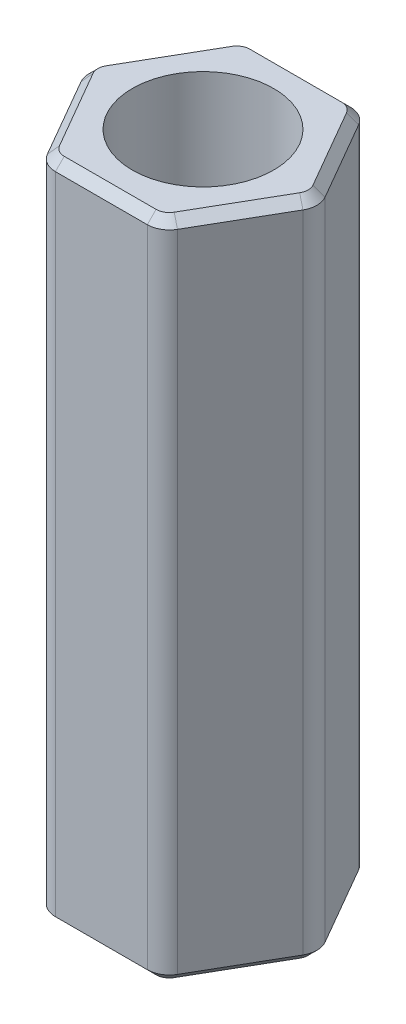
ISO-10303-21;
HEADER;
FILE_DESCRIPTION(('STEP AP214'),'2;1');
FILE_NAME('part.step','',(''),(''),'','','');
FILE_SCHEMA(('AUTOMOTIVE_DESIGN { 1 0 10303 214 1 1 1 1 }'));
ENDSEC;
DATA;
#1=APPLICATION_CONTEXT('core data for automotive mechanical design processes');
#2=APPLICATION_PROTOCOL_DEFINITION('international standard','automotive_design',2000,#1);
#3=PRODUCT_CONTEXT('',#1,'mechanical');
#4=PRODUCT('Part','Part','',(#3));
#5=PRODUCT_RELATED_PRODUCT_CATEGORY('part','',(#4));
#6=PRODUCT_DEFINITION_FORMATION('','',#4);
#7=PRODUCT_DEFINITION_CONTEXT('part definition',#1,'design');
#8=PRODUCT_DEFINITION('design','',#6,#7);
#9=PRODUCT_DEFINITION_SHAPE('','',#8);
#10=(LENGTH_UNIT() NAMED_UNIT(*) SI_UNIT(.MILLI.,.METRE.));
#11=(NAMED_UNIT(*) PLANE_ANGLE_UNIT() SI_UNIT($,.RADIAN.));
#12=(NAMED_UNIT(*) SI_UNIT($,.STERADIAN.) SOLID_ANGLE_UNIT());
#13=UNCERTAINTY_MEASURE_WITH_UNIT(LENGTH_MEASURE(1.E-05),#10,'distance_accuracy_value','');
#14=(GEOMETRIC_REPRESENTATION_CONTEXT(3) GLOBAL_UNCERTAINTY_ASSIGNED_CONTEXT((#13)) GLOBAL_UNIT_ASSIGNED_CONTEXT((#10,
#11,#12)) REPRESENTATION_CONTEXT('',''));
#15=CARTESIAN_POINT('',(0.,0.,0.));
#16=DIRECTION('',(0.,0.,1.));
#17=DIRECTION('',(1.,0.,0.));
#18=AXIS2_PLACEMENT_3D('',#15,#16,#17);
#19=CARTESIAN_POINT('',(-1.32790561913614,15.,2.3));
#20=DIRECTION('',(0.,0.,-1.));
#21=DIRECTION('',(-1.,0.,0.));
#22=AXIS2_PLACEMENT_3D('',#19,#20,#21);
#23=PLANE('',#22);
#24=DIRECTION('',(0.,-1.,0.));
#25=VECTOR('',#24,1.);
#26=CARTESIAN_POINT('',(1.03923048454133,15.,2.3));
#27=LINE('',#26,#25);
#28=CARTESIAN_POINT('',(1.03923048454133,0.199999999999999,2.3));
#29=VERTEX_POINT('',#28);
#30=CARTESIAN_POINT('',(1.03923048454133,14.8,2.3));
#31=VERTEX_POINT('',#30);
#32=EDGE_CURVE('E1073',#29,#31,#27,.F.);
#33=ORIENTED_EDGE('',*,*,#32,.T.);
#34=DIRECTION('',(-1.,0.,0.));
#35=VECTOR('',#34,1.);
#36=CARTESIAN_POINT('',(-1.03923048454132,14.8,2.3));
#37=LINE('',#36,#35);
#38=CARTESIAN_POINT('',(-1.03923048454132,14.8,2.3));
#39=VERTEX_POINT('',#38);
#40=EDGE_CURVE('E308',#31,#39,#37,.T.);
#41=ORIENTED_EDGE('',*,*,#40,.T.);
#42=DIRECTION('',(0.,-1.,0.));
#43=VECTOR('',#42,1.);
#44=CARTESIAN_POINT('',(-1.03923048454132,15.,2.3));
#45=LINE('',#44,#43);
#46=CARTESIAN_POINT('',(-1.03923048454132,0.199999999999999,2.3));
#47=VERTEX_POINT('',#46);
#48=EDGE_CURVE('E1078',#39,#47,#45,.T.);
#49=ORIENTED_EDGE('',*,*,#48,.T.);
#50=DIRECTION('',(1.,0.,0.));
#51=VECTOR('',#50,1.);
#52=CARTESIAN_POINT('',(-1.32790561913614,0.199999999999999,2.3));
#53=LINE('',#52,#51);
#54=EDGE_CURVE('E305',#47,#29,#53,.T.);
#55=ORIENTED_EDGE('',*,*,#54,.T.);
#56=EDGE_LOOP('',(#33,#41,#49,#55));
#57=FACE_BOUND('',#56,.T.);
#58=ADVANCED_FACE('F45',(#57),#23,.F.);
#59=CARTESIAN_POINT('',(1.32790561913614,15.,2.3));
#60=DIRECTION('',(-0.866025403784439,0.,-0.5));
#61=DIRECTION('',(-0.5,0.,0.866025403784439));
#62=AXIS2_PLACEMENT_3D('',#59,#60,#61);
#63=PLANE('',#62);
#64=DIRECTION('',(0.,-1.,0.));
#65=VECTOR('',#64,1.);
#66=CARTESIAN_POINT('',(2.51147367097487,15.,0.25));
#67=LINE('',#66,#65);
#68=CARTESIAN_POINT('',(2.51147367097487,0.199999999999999,0.25));
#69=VERTEX_POINT('',#68);
#70=CARTESIAN_POINT('',(2.51147367097487,14.8,0.25));
#71=VERTEX_POINT('',#70);
#72=EDGE_CURVE('E242',#69,#71,#67,.F.);
#73=ORIENTED_EDGE('',*,*,#72,.T.);
#74=DIRECTION('',(-0.5,0.,0.866025403784439));
#75=VECTOR('',#74,1.);
#76=CARTESIAN_POINT('',(1.47224318643355,14.8,2.05));
#77=LINE('',#76,#75);
#78=CARTESIAN_POINT('',(1.47224318643355,14.8,2.05));
#79=VERTEX_POINT('',#78);
#80=EDGE_CURVE('E332',#71,#79,#77,.T.);
#81=ORIENTED_EDGE('',*,*,#80,.T.);
#82=DIRECTION('',(0.,-1.,0.));
#83=VECTOR('',#82,1.);
#84=CARTESIAN_POINT('',(1.47224318643355,15.,2.05));
#85=LINE('',#84,#83);
#86=CARTESIAN_POINT('',(1.47224318643355,0.199999999999999,2.05));
#87=VERTEX_POINT('',#86);
#88=EDGE_CURVE('E248',#79,#87,#85,.T.);
#89=ORIENTED_EDGE('',*,*,#88,.T.);
#90=DIRECTION('',(0.5,0.,-0.866025403784439));
#91=VECTOR('',#90,1.);
#92=CARTESIAN_POINT('',(1.32790561913614,0.199999999999999,2.3));
#93=LINE('',#92,#91);
#94=EDGE_CURVE('E329',#87,#69,#93,.T.);
#95=ORIENTED_EDGE('',*,*,#94,.T.);
#96=EDGE_LOOP('',(#73,#81,#89,#95));
#97=FACE_BOUND('',#96,.T.);
#98=ADVANCED_FACE('F510',(#97),#63,.F.);
#99=CARTESIAN_POINT('',(2.65581123827228,15.,0.));
#100=DIRECTION('',(-0.866025403784438,0.,0.5));
#101=DIRECTION('',(0.5,0.,0.866025403784438));
#102=AXIS2_PLACEMENT_3D('',#99,#100,#101);
#103=PLANE('',#102);
#104=DIRECTION('',(0.,-1.,0.));
#105=VECTOR('',#104,1.);
#106=CARTESIAN_POINT('',(1.47224318643354,15.,-2.05));
#107=LINE('',#106,#105);
#108=CARTESIAN_POINT('',(1.47224318643354,0.199999999999999,-2.05));
#109=VERTEX_POINT('',#108);
#110=CARTESIAN_POINT('',(1.47224318643354,14.8,-2.05));
#111=VERTEX_POINT('',#110);
#112=EDGE_CURVE('E482',#109,#111,#107,.F.);
#113=ORIENTED_EDGE('',*,*,#112,.T.);
#114=DIRECTION('',(0.5,0.,0.866025403784438));
#115=VECTOR('',#114,1.);
#116=CARTESIAN_POINT('',(2.51147367097487,14.8,-0.25));
#117=LINE('',#116,#115);
#118=CARTESIAN_POINT('',(2.51147367097487,14.8,-0.25));
#119=VERTEX_POINT('',#118);
#120=EDGE_CURVE('E349',#111,#119,#117,.T.);
#121=ORIENTED_EDGE('',*,*,#120,.T.);
#122=DIRECTION('',(0.,-1.,0.));
#123=VECTOR('',#122,1.);
#124=CARTESIAN_POINT('',(2.51147367097487,15.,-0.25));
#125=LINE('',#124,#123);
#126=CARTESIAN_POINT('',(2.51147367097487,0.199999999999999,-0.25));
#127=VERTEX_POINT('',#126);
#128=EDGE_CURVE('E494',#119,#127,#125,.T.);
#129=ORIENTED_EDGE('',*,*,#128,.T.);
#130=DIRECTION('',(-0.5,0.,-0.866025403784438));
#131=VECTOR('',#130,1.);
#132=CARTESIAN_POINT('',(2.65581123827228,0.199999999999999,0.));
#133=LINE('',#132,#131);
#134=EDGE_CURVE('E346',#127,#109,#133,.T.);
#135=ORIENTED_EDGE('',*,*,#134,.T.);
#136=EDGE_LOOP('',(#113,#121,#129,#135));
#137=FACE_BOUND('',#136,.T.);
#138=ADVANCED_FACE('F535',(#137),#103,.F.);
#139=CARTESIAN_POINT('',(1.32790561913614,15.,-2.3));
#140=DIRECTION('',(0.,0.,1.));
#141=DIRECTION('',(1.,0.,0.));
#142=AXIS2_PLACEMENT_3D('',#139,#140,#141);
#143=PLANE('',#142);
#144=DIRECTION('',(0.,-1.,0.));
#145=VECTOR('',#144,1.);
#146=CARTESIAN_POINT('',(-1.03923048454133,15.,-2.3));
#147=LINE('',#146,#145);
#148=CARTESIAN_POINT('',(-1.03923048454133,0.199999999999999,-2.3));
#149=VERTEX_POINT('',#148);
#150=CARTESIAN_POINT('',(-1.03923048454133,14.8,-2.3));
#151=VERTEX_POINT('',#150);
#152=EDGE_CURVE('E489',#149,#151,#147,.F.);
#153=ORIENTED_EDGE('',*,*,#152,.T.);
#154=DIRECTION('',(1.,0.,0.));
#155=VECTOR('',#154,1.);
#156=CARTESIAN_POINT('',(1.03923048454133,14.8,-2.3));
#157=LINE('',#156,#155);
#158=CARTESIAN_POINT('',(1.03923048454133,14.8,-2.3));
#159=VERTEX_POINT('',#158);
#160=EDGE_CURVE('E282',#151,#159,#157,.T.);
#161=ORIENTED_EDGE('',*,*,#160,.T.);
#162=DIRECTION('',(0.,-1.,0.));
#163=VECTOR('',#162,1.);
#164=CARTESIAN_POINT('',(1.03923048454133,15.,-2.3));
#165=LINE('',#164,#163);
#166=CARTESIAN_POINT('',(1.03923048454133,0.199999999999999,-2.3));
#167=VERTEX_POINT('',#166);
#168=EDGE_CURVE('E480',#159,#167,#165,.T.);
#169=ORIENTED_EDGE('',*,*,#168,.T.);
#170=DIRECTION('',(-1.,0.,0.));
#171=VECTOR('',#170,1.);
#172=CARTESIAN_POINT('',(1.32790561913614,0.199999999999999,-2.3));
#173=LINE('',#172,#171);
#174=EDGE_CURVE('E279',#167,#149,#173,.T.);
#175=ORIENTED_EDGE('',*,*,#174,.T.);
#176=EDGE_LOOP('',(#153,#161,#169,#175));
#177=FACE_BOUND('',#176,.T.);
#178=ADVANCED_FACE('F485',(#177),#143,.F.);
#179=CARTESIAN_POINT('',(-1.32790561913614,15.,-2.3));
#180=DIRECTION('',(0.866025403784439,0.,0.5));
#181=DIRECTION('',(0.5,0.,-0.866025403784439));
#182=AXIS2_PLACEMENT_3D('',#179,#180,#181);
#183=PLANE('',#182);
#184=DIRECTION('',(0.,-1.,0.));
#185=VECTOR('',#184,1.);
#186=CARTESIAN_POINT('',(-2.51147367097487,15.,-0.25));
#187=LINE('',#186,#185);
#188=CARTESIAN_POINT('',(-2.51147367097487,0.199999999999999,-0.25));
#189=VERTEX_POINT('',#188);
#190=CARTESIAN_POINT('',(-2.51147367097487,14.8,-0.25));
#191=VERTEX_POINT('',#190);
#192=EDGE_CURVE('E490',#189,#191,#187,.F.);
#193=ORIENTED_EDGE('',*,*,#192,.T.);
#194=DIRECTION('',(0.5,0.,-0.866025403784439));
#195=VECTOR('',#194,1.);
#196=CARTESIAN_POINT('',(-1.47224318643355,14.8,-2.05));
#197=LINE('',#196,#195);
#198=CARTESIAN_POINT('',(-1.47224318643355,14.8,-2.05));
#199=VERTEX_POINT('',#198);
#200=EDGE_CURVE('E314',#191,#199,#197,.T.);
#201=ORIENTED_EDGE('',*,*,#200,.T.);
#202=DIRECTION('',(0.,-1.,0.));
#203=VECTOR('',#202,1.);
#204=CARTESIAN_POINT('',(-1.47224318643355,15.,-2.05));
#205=LINE('',#204,#203);
#206=CARTESIAN_POINT('',(-1.47224318643355,0.199999999999999,-2.05));
#207=VERTEX_POINT('',#206);
#208=EDGE_CURVE('E497',#199,#207,#205,.T.);
#209=ORIENTED_EDGE('',*,*,#208,.T.);
#210=DIRECTION('',(-0.5,0.,0.866025403784439));
#211=VECTOR('',#210,1.);
#212=CARTESIAN_POINT('',(-1.32790561913614,0.199999999999999,-2.3));
#213=LINE('',#212,#211);
#214=EDGE_CURVE('E311',#207,#189,#213,.T.);
#215=ORIENTED_EDGE('',*,*,#214,.T.);
#216=EDGE_LOOP('',(#193,#201,#209,#215));
#217=FACE_BOUND('',#216,.T.);
#218=ADVANCED_FACE('F873',(#217),#183,.F.);
#219=CARTESIAN_POINT('',(-2.65581123827228,15.,0.));
#220=DIRECTION('',(0.866025403784438,0.,-0.5));
#221=DIRECTION('',(-0.5,0.,-0.866025403784438));
#222=AXIS2_PLACEMENT_3D('',#219,#220,#221);
#223=PLANE('',#222);
#224=DIRECTION('',(0.,-1.,0.));
#225=VECTOR('',#224,1.);
#226=CARTESIAN_POINT('',(-1.47224318643354,15.,2.05));
#227=LINE('',#226,#225);
#228=CARTESIAN_POINT('',(-1.47224318643354,0.199999999999999,2.05));
#229=VERTEX_POINT('',#228);
#230=CARTESIAN_POINT('',(-1.47224318643354,14.8,2.05));
#231=VERTEX_POINT('',#230);
#232=EDGE_CURVE('E1086',#229,#231,#227,.F.);
#233=ORIENTED_EDGE('',*,*,#232,.T.);
#234=DIRECTION('',(-0.5,0.,-0.866025403784438));
#235=VECTOR('',#234,1.);
#236=CARTESIAN_POINT('',(-2.51147367097487,14.8,0.25));
#237=LINE('',#236,#235);
#238=CARTESIAN_POINT('',(-2.51147367097487,14.8,0.25));
#239=VERTEX_POINT('',#238);
#240=EDGE_CURVE('E289',#231,#239,#237,.T.);
#241=ORIENTED_EDGE('',*,*,#240,.T.);
#242=DIRECTION('',(0.,-1.,0.));
#243=VECTOR('',#242,1.);
#244=CARTESIAN_POINT('',(-2.51147367097487,15.,0.25));
#245=LINE('',#244,#243);
#246=CARTESIAN_POINT('',(-2.51147367097487,0.199999999999999,0.25));
#247=VERTEX_POINT('',#246);
#248=EDGE_CURVE('E1082',#239,#247,#245,.T.);
#249=ORIENTED_EDGE('',*,*,#248,.T.);
#250=DIRECTION('',(0.5,0.,0.866025403784438));
#251=VECTOR('',#250,1.);
#252=CARTESIAN_POINT('',(-2.65581123827228,0.199999999999999,0.));
#253=LINE('',#252,#251);
#254=EDGE_CURVE('E286',#247,#229,#253,.T.);
#255=ORIENTED_EDGE('',*,*,#254,.T.);
#256=EDGE_LOOP('',(#233,#241,#249,#255));
#257=FACE_BOUND('',#256,.T.);
#258=ADVANCED_FACE('F863',(#257),#223,.F.);
#259=CARTESIAN_POINT('',(0.,15.,0.));
#260=DIRECTION('',(0.,1.,0.));
#261=DIRECTION('',(0.,0.,1.));
#262=AXIS2_PLACEMENT_3D('',#259,#260,#261);
#263=PLANE('',#262);
#264=DIRECTION('',(-0.5,0.,0.866025403784439));
#265=VECTOR('',#264,1.);
#266=CARTESIAN_POINT('',(-2.33826859021799,15.,-0.150000000000001));
#267=LINE('',#266,#265);
#268=CARTESIAN_POINT('',(-1.29903810567666,15.,-1.95));
#269=VERTEX_POINT('',#268);
#270=CARTESIAN_POINT('',(-2.33826859021799,15.,-0.150000000000001));
#271=VERTEX_POINT('',#270);
#272=EDGE_CURVE('E273',#269,#271,#267,.T.);
#273=ORIENTED_EDGE('',*,*,#272,.T.);
#274=CARTESIAN_POINT('',(-2.07846096908265,15.,0.));
#275=DIRECTION('',(0.,1.,0.));
#276=DIRECTION('',(0.,0.,1.));
#277=AXIS2_PLACEMENT_3D('',#274,#275,#276);
#278=CIRCLE('',#277,0.300000000000002);
#279=CARTESIAN_POINT('',(-2.33826859021799,15.,0.150000000000001));
#280=VERTEX_POINT('',#279);
#281=EDGE_CURVE('E276',#271,#280,#278,.T.);
#282=ORIENTED_EDGE('',*,*,#281,.T.);
#283=DIRECTION('',(0.5,0.,0.866025403784439));
#284=VECTOR('',#283,1.);
#285=CARTESIAN_POINT('',(-1.29903810567666,15.,1.95));
#286=LINE('',#285,#284);
#287=CARTESIAN_POINT('',(-1.29903810567666,15.,1.95));
#288=VERTEX_POINT('',#287);
#289=EDGE_CURVE('E263',#280,#288,#286,.T.);
#290=ORIENTED_EDGE('',*,*,#289,.T.);
#291=CARTESIAN_POINT('',(-1.03923048454132,15.,1.8));
#292=DIRECTION('',(0.,1.,0.));
#293=DIRECTION('',(0.,0.,1.));
#294=AXIS2_PLACEMENT_3D('',#291,#292,#293);
#295=CIRCLE('',#294,0.300000000000002);
#296=CARTESIAN_POINT('',(-1.03923048454132,15.,2.1));
#297=VERTEX_POINT('',#296);
#298=EDGE_CURVE('E260',#288,#297,#295,.T.);
#299=ORIENTED_EDGE('',*,*,#298,.T.);
#300=DIRECTION('',(1.,0.,0.));
#301=VECTOR('',#300,1.);
#302=CARTESIAN_POINT('',(1.03923048454133,15.,2.1));
#303=LINE('',#302,#301);
#304=CARTESIAN_POINT('',(1.03923048454133,15.,2.1));
#305=VERTEX_POINT('',#304);
#306=EDGE_CURVE('E257',#297,#305,#303,.T.);
#307=ORIENTED_EDGE('',*,*,#306,.T.);
#308=CARTESIAN_POINT('',(1.03923048454133,15.,1.8));
#309=DIRECTION('',(0.,1.,0.));
#310=DIRECTION('',(0.,0.,1.));
#311=AXIS2_PLACEMENT_3D('',#308,#309,#310);
#312=CIRCLE('',#311,0.300000000000002);
#313=CARTESIAN_POINT('',(1.29903810567666,15.,1.95));
#314=VERTEX_POINT('',#313);
#315=EDGE_CURVE('E254',#305,#314,#312,.T.);
#316=ORIENTED_EDGE('',*,*,#315,.T.);
#317=DIRECTION('',(0.5,0.,-0.866025403784439));
#318=VECTOR('',#317,1.);
#319=CARTESIAN_POINT('',(2.33826859021799,15.,0.150000000000001));
#320=LINE('',#319,#318);
#321=CARTESIAN_POINT('',(2.33826859021799,15.,0.150000000000001));
#322=VERTEX_POINT('',#321);
#323=EDGE_CURVE('E219',#314,#322,#320,.T.);
#324=ORIENTED_EDGE('',*,*,#323,.T.);
#325=CARTESIAN_POINT('',(2.07846096908265,15.,0.));
#326=DIRECTION('',(0.,1.,0.));
#327=DIRECTION('',(0.,0.,1.));
#328=AXIS2_PLACEMENT_3D('',#325,#326,#327);
#329=CIRCLE('',#328,0.300000000000002);
#330=CARTESIAN_POINT('',(2.33826859021799,15.,-0.150000000000001));
#331=VERTEX_POINT('',#330);
#332=EDGE_CURVE('E211',#322,#331,#329,.T.);
#333=ORIENTED_EDGE('',*,*,#332,.T.);
#334=DIRECTION('',(-0.5,0.,-0.866025403784438));
#335=VECTOR('',#334,1.);
#336=CARTESIAN_POINT('',(1.29903810567666,15.,-1.95));
#337=LINE('',#336,#335);
#338=CARTESIAN_POINT('',(1.29903810567666,15.,-1.95));
#339=VERTEX_POINT('',#338);
#340=EDGE_CURVE('E216',#331,#339,#337,.T.);
#341=ORIENTED_EDGE('',*,*,#340,.T.);
#342=CARTESIAN_POINT('',(1.03923048454133,15.,-1.8));
#343=DIRECTION('',(0.,1.,0.));
#344=DIRECTION('',(0.,0.,1.));
#345=AXIS2_PLACEMENT_3D('',#342,#343,#344);
#346=CIRCLE('',#345,0.300000000000002);
#347=CARTESIAN_POINT('',(1.03923048454133,15.,-2.1));
#348=VERTEX_POINT('',#347);
#349=EDGE_CURVE('E224',#339,#348,#346,.T.);
#350=ORIENTED_EDGE('',*,*,#349,.T.);
#351=DIRECTION('',(-1.,0.,0.));
#352=VECTOR('',#351,1.);
#353=CARTESIAN_POINT('',(-1.03923048454133,15.,-2.1));
#354=LINE('',#353,#352);
#355=CARTESIAN_POINT('',(-1.03923048454133,15.,-2.1));
#356=VERTEX_POINT('',#355);
#357=EDGE_CURVE('E266',#348,#356,#354,.T.);
#358=ORIENTED_EDGE('',*,*,#357,.T.);
#359=CARTESIAN_POINT('',(-1.03923048454133,15.,-1.8));
#360=DIRECTION('',(0.,1.,0.));
#361=DIRECTION('',(0.,0.,1.));
#362=AXIS2_PLACEMENT_3D('',#359,#360,#361);
#363=CIRCLE('',#362,0.300000000000002);
#364=EDGE_CURVE('E270',#356,#269,#363,.T.);
#365=ORIENTED_EDGE('',*,*,#364,.T.);
#366=EDGE_LOOP('',(#273,#282,#290,#299,#307,#316,#324,#333,#341,#350,#358,#365));
#367=FACE_BOUND('',#366,.T.);
#368=CARTESIAN_POINT('',(0.,15.,0.));
#369=DIRECTION('',(0.,1.,0.));
#370=DIRECTION('',(0.,0.,1.));
#371=AXIS2_PLACEMENT_3D('',#368,#369,#370);
#372=CIRCLE('',#371,1.6);
#373=CARTESIAN_POINT('',(0.,15.,1.6));
#374=VERTEX_POINT('',#373);
#375=EDGE_CURVE('E420',#374,#374,#372,.T.);
#376=ORIENTED_EDGE('',*,*,#375,.F.);
#377=EDGE_LOOP('',(#376));
#378=FACE_BOUND('',#377,.T.);
#379=ADVANCED_FACE('F213',(#367,#378),#263,.T.);
#380=CARTESIAN_POINT('',(0.,0.,0.));
#381=DIRECTION('',(0.,1.,0.));
#382=DIRECTION('',(0.,0.,1.));
#383=AXIS2_PLACEMENT_3D('',#380,#381,#382);
#384=PLANE('',#383);
#385=DIRECTION('',(-1.,0.,0.));
#386=VECTOR('',#385,1.);
#387=CARTESIAN_POINT('',(0.,0.,2.1));
#388=LINE('',#387,#386);
#389=CARTESIAN_POINT('',(1.03923048454133,0.,2.1));
#390=VERTEX_POINT('',#389);
#391=CARTESIAN_POINT('',(-1.03923048454132,0.,2.1));
#392=VERTEX_POINT('',#391);
#393=EDGE_CURVE('E71',#390,#392,#388,.T.);
#394=ORIENTED_EDGE('',*,*,#393,.T.);
#395=CARTESIAN_POINT('',(-1.03923048454132,0.,1.8));
#396=DIRECTION('',(0.,1.,0.));
#397=DIRECTION('',(0.,0.,1.));
#398=AXIS2_PLACEMENT_3D('',#395,#396,#397);
#399=CIRCLE('',#398,0.300000000000003);
#400=CARTESIAN_POINT('',(-1.29903810567666,0.,1.95));
#401=VERTEX_POINT('',#400);
#402=EDGE_CURVE('E11',#392,#401,#399,.F.);
#403=ORIENTED_EDGE('',*,*,#402,.T.);
#404=DIRECTION('',(-0.5,0.,-0.866025403784439));
#405=VECTOR('',#404,1.);
#406=CARTESIAN_POINT('',(-1.81865334794732,0.,1.05));
#407=LINE('',#406,#405);
#408=CARTESIAN_POINT('',(-2.33826859021799,0.,0.150000000000001));
#409=VERTEX_POINT('',#408);
#410=EDGE_CURVE('E56',#401,#409,#407,.T.);
#411=ORIENTED_EDGE('',*,*,#410,.T.);
#412=CARTESIAN_POINT('',(-2.07846096908265,0.,0.));
#413=DIRECTION('',(0.,1.,0.));
#414=DIRECTION('',(0.,0.,1.));
#415=AXIS2_PLACEMENT_3D('',#412,#413,#414);
#416=CIRCLE('',#415,0.300000000000002);
#417=CARTESIAN_POINT('',(-2.33826859021799,0.,-0.150000000000002));
#418=VERTEX_POINT('',#417);
#419=EDGE_CURVE('E376',#409,#418,#416,.F.);
#420=ORIENTED_EDGE('',*,*,#419,.T.);
#421=DIRECTION('',(0.5,0.,-0.866025403784439));
#422=VECTOR('',#421,1.);
#423=CARTESIAN_POINT('',(-1.81865334794732,0.,-1.05));
#424=LINE('',#423,#422);
#425=CARTESIAN_POINT('',(-1.29903810567666,0.,-1.95));
#426=VERTEX_POINT('',#425);
#427=EDGE_CURVE('E370',#418,#426,#424,.T.);
#428=ORIENTED_EDGE('',*,*,#427,.T.);
#429=CARTESIAN_POINT('',(-1.03923048454133,0.,-1.8));
#430=DIRECTION('',(0.,1.,0.));
#431=DIRECTION('',(0.,0.,1.));
#432=AXIS2_PLACEMENT_3D('',#429,#430,#431);
#433=CIRCLE('',#432,0.300000000000003);
#434=CARTESIAN_POINT('',(-1.03923048454133,0.,-2.1));
#435=VERTEX_POINT('',#434);
#436=EDGE_CURVE('E364',#426,#435,#433,.F.);
#437=ORIENTED_EDGE('',*,*,#436,.T.);
#438=DIRECTION('',(1.,0.,0.));
#439=VECTOR('',#438,1.);
#440=CARTESIAN_POINT('',(0.,0.,-2.1));
#441=LINE('',#440,#439);
#442=CARTESIAN_POINT('',(1.03923048454133,0.,-2.1));
#443=VERTEX_POINT('',#442);
#444=EDGE_CURVE('E358',#435,#443,#441,.T.);
#445=ORIENTED_EDGE('',*,*,#444,.T.);
#446=CARTESIAN_POINT('',(1.03923048454133,0.,-1.8));
#447=DIRECTION('',(0.,1.,0.));
#448=DIRECTION('',(0.,0.,1.));
#449=AXIS2_PLACEMENT_3D('',#446,#447,#448);
#450=CIRCLE('',#449,0.300000000000002);
#451=CARTESIAN_POINT('',(1.29903810567666,0.,-1.95));
#452=VERTEX_POINT('',#451);
#453=EDGE_CURVE('E352',#443,#452,#450,.F.);
#454=ORIENTED_EDGE('',*,*,#453,.T.);
#455=DIRECTION('',(0.5,0.,0.866025403784438));
#456=VECTOR('',#455,1.);
#457=CARTESIAN_POINT('',(1.81865334794732,0.,-1.05));
#458=LINE('',#457,#456);
#459=CARTESIAN_POINT('',(2.33826859021799,0.,-0.150000000000001));
#460=VERTEX_POINT('',#459);
#461=EDGE_CURVE('E355',#452,#460,#458,.T.);
#462=ORIENTED_EDGE('',*,*,#461,.T.);
#463=CARTESIAN_POINT('',(2.07846096908265,0.,0.));
#464=DIRECTION('',(0.,1.,0.));
#465=DIRECTION('',(0.,0.,1.));
#466=AXIS2_PLACEMENT_3D('',#463,#464,#465);
#467=CIRCLE('',#466,0.300000000000002);
#468=CARTESIAN_POINT('',(2.33826859021799,0.,0.150000000000001));
#469=VERTEX_POINT('',#468);
#470=EDGE_CURVE('E361',#460,#469,#467,.F.);
#471=ORIENTED_EDGE('',*,*,#470,.T.);
#472=DIRECTION('',(-0.5,0.,0.866025403784439));
#473=VECTOR('',#472,1.);
#474=CARTESIAN_POINT('',(1.81865334794732,0.,1.05));
#475=LINE('',#474,#473);
#476=CARTESIAN_POINT('',(1.29903810567666,0.,1.95));
#477=VERTEX_POINT('',#476);
#478=EDGE_CURVE('E367',#469,#477,#475,.T.);
#479=ORIENTED_EDGE('',*,*,#478,.T.);
#480=CARTESIAN_POINT('',(1.03923048454133,0.,1.8));
#481=DIRECTION('',(0.,1.,0.));
#482=DIRECTION('',(0.,0.,1.));
#483=AXIS2_PLACEMENT_3D('',#480,#481,#482);
#484=CIRCLE('',#483,0.300000000000002);
#485=EDGE_CURVE('E373',#477,#390,#484,.F.);
#486=ORIENTED_EDGE('',*,*,#485,.T.);
#487=EDGE_LOOP('',(#394,#403,#411,#420,#428,#437,#445,#454,#462,#471,#479,#486));
#488=FACE_BOUND('',#487,.T.);
#489=CARTESIAN_POINT('',(0.,0.,0.));
#490=DIRECTION('',(0.,1.,0.));
#491=DIRECTION('',(0.,0.,1.));
#492=AXIS2_PLACEMENT_3D('',#489,#490,#491);
#493=CIRCLE('',#492,1.6);
#494=CARTESIAN_POINT('',(0.,0.,1.6));
#495=VERTEX_POINT('',#494);
#496=EDGE_CURVE('E1067',#495,#495,#493,.T.);
#497=ORIENTED_EDGE('',*,*,#496,.T.);
#498=EDGE_LOOP('',(#497));
#499=FACE_BOUND('',#498,.T.);
#500=ADVANCED_FACE('F525',(#488,#499),#384,.F.);
#501=CARTESIAN_POINT('',(0.,0.,0.));
#502=DIRECTION('',(0.,1.,0.));
#503=DIRECTION('',(0.,0.,1.));
#504=AXIS2_PLACEMENT_3D('',#501,#502,#503);
#505=CYLINDRICAL_SURFACE('',#504,1.6);
#506=ORIENTED_EDGE('',*,*,#496,.F.);
#507=EDGE_LOOP('',(#506));
#508=FACE_BOUND('',#507,.T.);
#509=ORIENTED_EDGE('',*,*,#375,.T.);
#510=EDGE_LOOP('',(#509));
#511=FACE_BOUND('',#510,.T.);
#512=ADVANCED_FACE('F603',(#508,#511),#505,.F.);
#513=CARTESIAN_POINT('',(-1.03923048454132,15.,1.8));
#514=DIRECTION('',(0.,-1.,0.));
#515=DIRECTION('',(0.,0.,-1.));
#516=AXIS2_PLACEMENT_3D('',#513,#514,#515);
#517=CYLINDRICAL_SURFACE('',#516,0.5);
#518=ORIENTED_EDGE('',*,*,#48,.F.);
#519=CARTESIAN_POINT('',(-1.03923048454132,14.8,1.8));
#520=DIRECTION('',(0.,1.,0.));
#521=DIRECTION('',(0.,0.,1.));
#522=AXIS2_PLACEMENT_3D('',#519,#520,#521);
#523=CIRCLE('',#522,0.5);
#524=EDGE_CURVE('E296',#39,#231,#523,.F.);
#525=ORIENTED_EDGE('',*,*,#524,.T.);
#526=ORIENTED_EDGE('',*,*,#232,.F.);
#527=CARTESIAN_POINT('',(-1.03923048454132,0.199999999999999,1.8));
#528=DIRECTION('',(0.,1.,0.));
#529=DIRECTION('',(0.,0.,1.));
#530=AXIS2_PLACEMENT_3D('',#527,#528,#529);
#531=CIRCLE('',#530,0.5);
#532=EDGE_CURVE('E292',#229,#47,#531,.T.);
#533=ORIENTED_EDGE('',*,*,#532,.T.);
#534=EDGE_LOOP('',(#518,#525,#526,#533));
#535=FACE_BOUND('',#534,.T.);
#536=ADVANCED_FACE('F599',(#535),#517,.T.);
#537=CARTESIAN_POINT('',(-2.07846096908265,15.,0.));
#538=DIRECTION('',(0.,-1.,0.));
#539=DIRECTION('',(0.,0.,-1.));
#540=AXIS2_PLACEMENT_3D('',#537,#538,#539);
#541=CYLINDRICAL_SURFACE('',#540,0.5);
#542=ORIENTED_EDGE('',*,*,#248,.F.);
#543=CARTESIAN_POINT('',(-2.07846096908265,14.8,0.));
#544=DIRECTION('',(0.,1.,0.));
#545=DIRECTION('',(0.,0.,1.));
#546=AXIS2_PLACEMENT_3D('',#543,#544,#545);
#547=CIRCLE('',#546,0.5);
#548=EDGE_CURVE('E302',#239,#191,#547,.F.);
#549=ORIENTED_EDGE('',*,*,#548,.T.);
#550=ORIENTED_EDGE('',*,*,#192,.F.);
#551=CARTESIAN_POINT('',(-2.07846096908265,0.199999999999999,0.));
#552=DIRECTION('',(0.,1.,0.));
#553=DIRECTION('',(0.,0.,1.));
#554=AXIS2_PLACEMENT_3D('',#551,#552,#553);
#555=CIRCLE('',#554,0.5);
#556=EDGE_CURVE('E299',#189,#247,#555,.T.);
#557=ORIENTED_EDGE('',*,*,#556,.T.);
#558=EDGE_LOOP('',(#542,#549,#550,#557));
#559=FACE_BOUND('',#558,.T.);
#560=ADVANCED_FACE('F602',(#559),#541,.T.);
#561=CARTESIAN_POINT('',(-1.03923048454133,15.,-1.8));
#562=DIRECTION('',(0.,-1.,0.));
#563=DIRECTION('',(0.,0.,-1.));
#564=AXIS2_PLACEMENT_3D('',#561,#562,#563);
#565=CYLINDRICAL_SURFACE('',#564,0.5);
#566=ORIENTED_EDGE('',*,*,#208,.F.);
#567=CARTESIAN_POINT('',(-1.03923048454133,14.8,-1.8));
#568=DIRECTION('',(0.,1.,0.));
#569=DIRECTION('',(0.,0.,1.));
#570=AXIS2_PLACEMENT_3D('',#567,#568,#569);
#571=CIRCLE('',#570,0.5);
#572=EDGE_CURVE('E326',#199,#151,#571,.F.);
#573=ORIENTED_EDGE('',*,*,#572,.T.);
#574=ORIENTED_EDGE('',*,*,#152,.F.);
#575=CARTESIAN_POINT('',(-1.03923048454133,0.199999999999999,-1.8));
#576=DIRECTION('',(0.,1.,0.));
#577=DIRECTION('',(0.,0.,1.));
#578=AXIS2_PLACEMENT_3D('',#575,#576,#577);
#579=CIRCLE('',#578,0.5);
#580=EDGE_CURVE('E323',#149,#207,#579,.T.);
#581=ORIENTED_EDGE('',*,*,#580,.T.);
#582=EDGE_LOOP('',(#566,#573,#574,#581));
#583=FACE_BOUND('',#582,.T.);
#584=ADVANCED_FACE('F607',(#583),#565,.T.);
#585=CARTESIAN_POINT('',(1.03923048454133,15.,-1.8));
#586=DIRECTION('',(0.,-1.,0.));
#587=DIRECTION('',(0.,0.,-1.));
#588=AXIS2_PLACEMENT_3D('',#585,#586,#587);
#589=CYLINDRICAL_SURFACE('',#588,0.5);
#590=ORIENTED_EDGE('',*,*,#168,.F.);
#591=CARTESIAN_POINT('',(1.03923048454133,14.8,-1.8));
#592=DIRECTION('',(0.,1.,0.));
#593=DIRECTION('',(0.,0.,1.));
#594=AXIS2_PLACEMENT_3D('',#591,#592,#593);
#595=CIRCLE('',#594,0.5);
#596=EDGE_CURVE('E343',#159,#111,#595,.F.);
#597=ORIENTED_EDGE('',*,*,#596,.T.);
#598=ORIENTED_EDGE('',*,*,#112,.F.);
#599=CARTESIAN_POINT('',(1.03923048454133,0.199999999999999,-1.8));
#600=DIRECTION('',(0.,1.,0.));
#601=DIRECTION('',(0.,0.,1.));
#602=AXIS2_PLACEMENT_3D('',#599,#600,#601);
#603=CIRCLE('',#602,0.5);
#604=EDGE_CURVE('E340',#109,#167,#603,.T.);
#605=ORIENTED_EDGE('',*,*,#604,.T.);
#606=EDGE_LOOP('',(#590,#597,#598,#605));
#607=FACE_BOUND('',#606,.T.);
#608=ADVANCED_FACE('F479',(#607),#589,.T.);
#609=CARTESIAN_POINT('',(2.07846096908265,15.,0.));
#610=DIRECTION('',(0.,-1.,0.));
#611=DIRECTION('',(0.,0.,-1.));
#612=AXIS2_PLACEMENT_3D('',#609,#610,#611);
#613=CYLINDRICAL_SURFACE('',#612,0.5);
#614=ORIENTED_EDGE('',*,*,#128,.F.);
#615=CARTESIAN_POINT('',(2.07846096908265,14.8,0.));
#616=DIRECTION('',(0.,1.,0.));
#617=DIRECTION('',(0.,0.,1.));
#618=AXIS2_PLACEMENT_3D('',#615,#616,#617);
#619=CIRCLE('',#618,0.5);
#620=EDGE_CURVE('E230',#119,#71,#619,.F.);
#621=ORIENTED_EDGE('',*,*,#620,.T.);
#622=ORIENTED_EDGE('',*,*,#72,.F.);
#623=CARTESIAN_POINT('',(2.07846096908265,0.199999999999999,0.));
#624=DIRECTION('',(0.,1.,0.));
#625=DIRECTION('',(0.,0.,1.));
#626=AXIS2_PLACEMENT_3D('',#623,#624,#625);
#627=CIRCLE('',#626,0.5);
#628=EDGE_CURVE('E335',#69,#127,#627,.T.);
#629=ORIENTED_EDGE('',*,*,#628,.T.);
#630=EDGE_LOOP('',(#614,#621,#622,#629));
#631=FACE_BOUND('',#630,.T.);
#632=ADVANCED_FACE('F533',(#631),#613,.T.);
#633=CARTESIAN_POINT('',(1.03923048454133,15.,1.8));
#634=DIRECTION('',(0.,-1.,0.));
#635=DIRECTION('',(0.,0.,-1.));
#636=AXIS2_PLACEMENT_3D('',#633,#634,#635);
#637=CYLINDRICAL_SURFACE('',#636,0.5);
#638=ORIENTED_EDGE('',*,*,#88,.F.);
#639=CARTESIAN_POINT('',(1.03923048454133,14.8,1.8));
#640=DIRECTION('',(0.,1.,0.));
#641=DIRECTION('',(0.,0.,1.));
#642=AXIS2_PLACEMENT_3D('',#639,#640,#641);
#643=CIRCLE('',#642,0.5);
#644=EDGE_CURVE('E320',#79,#31,#643,.F.);
#645=ORIENTED_EDGE('',*,*,#644,.T.);
#646=ORIENTED_EDGE('',*,*,#32,.F.);
#647=CARTESIAN_POINT('',(1.03923048454133,0.199999999999999,1.8));
#648=DIRECTION('',(0.,1.,0.));
#649=DIRECTION('',(0.,0.,1.));
#650=AXIS2_PLACEMENT_3D('',#647,#648,#649);
#651=CIRCLE('',#650,0.5);
#652=EDGE_CURVE('E317',#29,#87,#651,.T.);
#653=ORIENTED_EDGE('',*,*,#652,.T.);
#654=EDGE_LOOP('',(#638,#645,#646,#653));
#655=FACE_BOUND('',#654,.T.);
#656=ADVANCED_FACE('F616',(#655),#637,.T.);
#657=CARTESIAN_POINT('',(0.,15.,2.1));
#658=DIRECTION('',(0.,0.70710678118655,0.707106781186545));
#659=DIRECTION('',(-1.,0.,0.));
#660=AXIS2_PLACEMENT_3D('',#657,#658,#659);
#661=PLANE('',#660);
#662=DIRECTION('',(0.,0.707106781186545,-0.70710678118655));
#663=VECTOR('',#662,1.);
#664=CARTESIAN_POINT('',(-1.03923048454132,14.8,2.3));
#665=LINE('',#664,#663);
#666=EDGE_CURVE('E412',#39,#297,#665,.T.);
#667=ORIENTED_EDGE('',*,*,#666,.F.);
#668=ORIENTED_EDGE('',*,*,#40,.F.);
#669=DIRECTION('',(0.,-0.707106781186545,0.70710678118655));
#670=VECTOR('',#669,1.);
#671=CARTESIAN_POINT('',(1.03923048454133,15.,2.1));
#672=LINE('',#671,#670);
#673=EDGE_CURVE('E416',#305,#31,#672,.T.);
#674=ORIENTED_EDGE('',*,*,#673,.F.);
#675=ORIENTED_EDGE('',*,*,#306,.F.);
#676=EDGE_LOOP('',(#667,#668,#674,#675));
#677=FACE_BOUND('',#676,.T.);
#678=ADVANCED_FACE('F572',(#677),#661,.T.);
#679=CARTESIAN_POINT('',(1.03923048454133,15.,1.8));
#680=DIRECTION('',(0.,-1.,0.));
#681=DIRECTION('',(0.,0.,-1.));
#682=AXIS2_PLACEMENT_3D('',#679,#680,#681);
#683=CONICAL_SURFACE('',#682,0.300000000000002,0.785398163397451);
#684=ORIENTED_EDGE('',*,*,#673,.T.);
#685=ORIENTED_EDGE('',*,*,#644,.F.);
#686=DIRECTION('',(0.612372435695796,-0.707106781186546,0.353553390593274));
#687=VECTOR('',#686,1.);
#688=CARTESIAN_POINT('',(1.29903810567666,15.,1.95));
#689=LINE('',#688,#687);
#690=EDGE_CURVE('E408',#314,#79,#689,.T.);
#691=ORIENTED_EDGE('',*,*,#690,.F.);
#692=ORIENTED_EDGE('',*,*,#315,.F.);
#693=EDGE_LOOP('',(#684,#685,#691,#692));
#694=FACE_BOUND('',#693,.T.);
#695=ADVANCED_FACE('F577',(#694),#683,.T.);
#696=CARTESIAN_POINT('',(-1.03923048454132,15.,1.8));
#697=DIRECTION('',(0.,-1.,0.));
#698=DIRECTION('',(0.,0.,-1.));
#699=AXIS2_PLACEMENT_3D('',#696,#697,#698);
#700=CONICAL_SURFACE('',#699,0.300000000000002,0.785398163397451);
#701=ORIENTED_EDGE('',*,*,#666,.T.);
#702=ORIENTED_EDGE('',*,*,#298,.F.);
#703=DIRECTION('',(0.612372435695796,0.707106781186545,-0.353553390593275));
#704=VECTOR('',#703,1.);
#705=CARTESIAN_POINT('',(-1.47224318643354,14.8,2.05));
#706=LINE('',#705,#704);
#707=EDGE_CURVE('E404',#231,#288,#706,.T.);
#708=ORIENTED_EDGE('',*,*,#707,.F.);
#709=ORIENTED_EDGE('',*,*,#524,.F.);
#710=EDGE_LOOP('',(#701,#702,#708,#709));
#711=FACE_BOUND('',#710,.T.);
#712=ADVANCED_FACE('F567',(#711),#700,.T.);
#713=CARTESIAN_POINT('',(1.81865334794732,15.,1.05));
#714=DIRECTION('',(0.612372435695793,0.70710678118655,0.353553390593273));
#715=DIRECTION('',(-0.5,0.,0.866025403784439));
#716=AXIS2_PLACEMENT_3D('',#713,#714,#715);
#717=PLANE('',#716);
#718=ORIENTED_EDGE('',*,*,#690,.T.);
#719=ORIENTED_EDGE('',*,*,#80,.F.);
#720=DIRECTION('',(0.612372435695796,-0.707106781186546,0.353553390593275));
#721=VECTOR('',#720,1.);
#722=CARTESIAN_POINT('',(2.33826859021799,15.,0.150000000000001));
#723=LINE('',#722,#721);
#724=EDGE_CURVE('E401',#322,#71,#723,.T.);
#725=ORIENTED_EDGE('',*,*,#724,.F.);
#726=ORIENTED_EDGE('',*,*,#323,.F.);
#727=EDGE_LOOP('',(#718,#719,#725,#726));
#728=FACE_BOUND('',#727,.T.);
#729=ADVANCED_FACE('F579',(#728),#717,.T.);
#730=CARTESIAN_POINT('',(-1.81865334794732,15.,1.05));
#731=DIRECTION('',(-0.612372435695793,0.707106781186549,0.353553390593273));
#732=DIRECTION('',(-0.5,0.,-0.866025403784438));
#733=AXIS2_PLACEMENT_3D('',#730,#731,#732);
#734=PLANE('',#733);
#735=ORIENTED_EDGE('',*,*,#707,.T.);
#736=ORIENTED_EDGE('',*,*,#289,.F.);
#737=DIRECTION('',(0.612372435695796,0.707106781186545,-0.353553390593275));
#738=VECTOR('',#737,1.);
#739=CARTESIAN_POINT('',(-2.51147367097487,14.8,0.25));
#740=LINE('',#739,#738);
#741=EDGE_CURVE('E234',#239,#280,#740,.T.);
#742=ORIENTED_EDGE('',*,*,#741,.F.);
#743=ORIENTED_EDGE('',*,*,#240,.F.);
#744=EDGE_LOOP('',(#735,#736,#742,#743));
#745=FACE_BOUND('',#744,.T.);
#746=ADVANCED_FACE('F562',(#745),#734,.T.);
#747=CARTESIAN_POINT('',(2.07846096908265,15.,0.));
#748=DIRECTION('',(0.,-1.,0.));
#749=DIRECTION('',(0.,0.,-1.));
#750=AXIS2_PLACEMENT_3D('',#747,#748,#749);
#751=CONICAL_SURFACE('',#750,0.300000000000002,0.785398163397451);
#752=ORIENTED_EDGE('',*,*,#724,.T.);
#753=ORIENTED_EDGE('',*,*,#620,.F.);
#754=DIRECTION('',(0.612372435695796,-0.707106781186545,-0.353553390593275));
#755=VECTOR('',#754,1.);
#756=CARTESIAN_POINT('',(2.33826859021799,15.,-0.150000000000001));
#757=LINE('',#756,#755);
#758=EDGE_CURVE('E228',#331,#119,#757,.T.);
#759=ORIENTED_EDGE('',*,*,#758,.F.);
#760=ORIENTED_EDGE('',*,*,#332,.F.);
#761=EDGE_LOOP('',(#752,#753,#759,#760));
#762=FACE_BOUND('',#761,.T.);
#763=ADVANCED_FACE('F229',(#762),#751,.T.);
#764=CARTESIAN_POINT('',(-2.07846096908265,15.,0.));
#765=DIRECTION('',(0.,-1.,0.));
#766=DIRECTION('',(0.,0.,-1.));
#767=AXIS2_PLACEMENT_3D('',#764,#765,#766);
#768=CONICAL_SURFACE('',#767,0.300000000000002,0.785398163397451);
#769=ORIENTED_EDGE('',*,*,#741,.T.);
#770=ORIENTED_EDGE('',*,*,#281,.F.);
#771=DIRECTION('',(0.612372435695796,0.707106781186546,0.353553390593275));
#772=VECTOR('',#771,1.);
#773=CARTESIAN_POINT('',(-2.51147367097487,14.8,-0.25));
#774=LINE('',#773,#772);
#775=EDGE_CURVE('E235',#191,#271,#774,.T.);
#776=ORIENTED_EDGE('',*,*,#775,.F.);
#777=ORIENTED_EDGE('',*,*,#548,.F.);
#778=EDGE_LOOP('',(#769,#770,#776,#777));
#779=FACE_BOUND('',#778,.T.);
#780=ADVANCED_FACE('F557',(#779),#768,.T.);
#781=CARTESIAN_POINT('',(1.81865334794732,15.,-1.05));
#782=DIRECTION('',(0.612372435695794,0.707106781186548,-0.353553390593274));
#783=DIRECTION('',(0.5,0.,0.866025403784438));
#784=AXIS2_PLACEMENT_3D('',#781,#782,#783);
#785=PLANE('',#784);
#786=ORIENTED_EDGE('',*,*,#758,.T.);
#787=ORIENTED_EDGE('',*,*,#120,.F.);
#788=DIRECTION('',(0.612372435695795,-0.707106781186546,-0.353553390593275));
#789=VECTOR('',#788,1.);
#790=CARTESIAN_POINT('',(1.29903810567666,15.,-1.95));
#791=LINE('',#790,#789);
#792=EDGE_CURVE('E239',#339,#111,#791,.T.);
#793=ORIENTED_EDGE('',*,*,#792,.F.);
#794=ORIENTED_EDGE('',*,*,#340,.F.);
#795=EDGE_LOOP('',(#786,#787,#793,#794));
#796=FACE_BOUND('',#795,.T.);
#797=ADVANCED_FACE('F237',(#796),#785,.T.);
#798=CARTESIAN_POINT('',(-1.81865334794732,15.,-1.05));
#799=DIRECTION('',(-0.612372435695793,0.70710678118655,-0.353553390593273));
#800=DIRECTION('',(0.5,0.,-0.866025403784439));
#801=AXIS2_PLACEMENT_3D('',#798,#799,#800);
#802=PLANE('',#801);
#803=ORIENTED_EDGE('',*,*,#775,.T.);
#804=ORIENTED_EDGE('',*,*,#272,.F.);
#805=DIRECTION('',(0.612372435695796,0.707106781186545,0.353553390593275));
#806=VECTOR('',#805,1.);
#807=CARTESIAN_POINT('',(-1.47224318643355,14.8,-2.05));
#808=LINE('',#807,#806);
#809=EDGE_CURVE('E389',#199,#269,#808,.T.);
#810=ORIENTED_EDGE('',*,*,#809,.F.);
#811=ORIENTED_EDGE('',*,*,#200,.F.);
#812=EDGE_LOOP('',(#803,#804,#810,#811));
#813=FACE_BOUND('',#812,.T.);
#814=ADVANCED_FACE('F552',(#813),#802,.T.);
#815=CARTESIAN_POINT('',(1.03923048454133,15.,-1.8));
#816=DIRECTION('',(0.,-1.,0.));
#817=DIRECTION('',(0.,0.,-1.));
#818=AXIS2_PLACEMENT_3D('',#815,#816,#817);
#819=CONICAL_SURFACE('',#818,0.300000000000002,0.785398163397451);
#820=ORIENTED_EDGE('',*,*,#792,.T.);
#821=ORIENTED_EDGE('',*,*,#596,.F.);
#822=DIRECTION('',(0.,-0.707106781186545,-0.70710678118655));
#823=VECTOR('',#822,1.);
#824=CARTESIAN_POINT('',(1.03923048454133,15.,-2.1));
#825=LINE('',#824,#823);
#826=EDGE_CURVE('E386',#348,#159,#825,.T.);
#827=ORIENTED_EDGE('',*,*,#826,.F.);
#828=ORIENTED_EDGE('',*,*,#349,.F.);
#829=EDGE_LOOP('',(#820,#821,#827,#828));
#830=FACE_BOUND('',#829,.T.);
#831=ADVANCED_FACE('F538',(#830),#819,.T.);
#832=CARTESIAN_POINT('',(-1.03923048454133,15.,-1.8));
#833=DIRECTION('',(0.,-1.,0.));
#834=DIRECTION('',(0.,0.,-1.));
#835=AXIS2_PLACEMENT_3D('',#832,#833,#834);
#836=CONICAL_SURFACE('',#835,0.300000000000002,0.785398163397451);
#837=ORIENTED_EDGE('',*,*,#809,.T.);
#838=ORIENTED_EDGE('',*,*,#364,.F.);
#839=DIRECTION('',(0.,0.707106781186545,0.70710678118655));
#840=VECTOR('',#839,1.);
#841=CARTESIAN_POINT('',(-1.03923048454133,14.8,-2.3));
#842=LINE('',#841,#840);
#843=EDGE_CURVE('E383',#151,#356,#842,.T.);
#844=ORIENTED_EDGE('',*,*,#843,.F.);
#845=ORIENTED_EDGE('',*,*,#572,.F.);
#846=EDGE_LOOP('',(#837,#838,#844,#845));
#847=FACE_BOUND('',#846,.T.);
#848=ADVANCED_FACE('F548',(#847),#836,.T.);
#849=CARTESIAN_POINT('',(0.,15.,-2.1));
#850=DIRECTION('',(0.,0.707106781186544,-0.707106781186551));
#851=DIRECTION('',(1.,0.,0.));
#852=AXIS2_PLACEMENT_3D('',#849,#850,#851);
#853=PLANE('',#852);
#854=ORIENTED_EDGE('',*,*,#826,.T.);
#855=ORIENTED_EDGE('',*,*,#160,.F.);
#856=ORIENTED_EDGE('',*,*,#843,.T.);
#857=ORIENTED_EDGE('',*,*,#357,.F.);
#858=EDGE_LOOP('',(#854,#855,#856,#857));
#859=FACE_BOUND('',#858,.T.);
#860=ADVANCED_FACE('F544',(#859),#853,.T.);
#861=CARTESIAN_POINT('',(1.03923048454133,0.,-1.8));
#862=DIRECTION('',(0.,1.,0.));
#863=DIRECTION('',(0.,0.,1.));
#864=AXIS2_PLACEMENT_3D('',#861,#862,#863);
#865=CONICAL_SURFACE('',#864,0.300000000000002,0.785398163397445);
#866=DIRECTION('',(0.,-0.70710678118655,0.707106781186545));
#867=VECTOR('',#866,1.);
#868=CARTESIAN_POINT('',(1.03923048454133,0.199999999999999,-2.3));
#869=LINE('',#868,#867);
#870=EDGE_CURVE('E457',#167,#443,#869,.T.);
#871=ORIENTED_EDGE('',*,*,#870,.F.);
#872=ORIENTED_EDGE('',*,*,#604,.F.);
#873=DIRECTION('',(0.612372435695793,0.707106781186549,-0.353553390593273));
#874=VECTOR('',#873,1.);
#875=CARTESIAN_POINT('',(1.29903810567666,0.,-1.95));
#876=LINE('',#875,#874);
#877=EDGE_CURVE('E50',#452,#109,#876,.T.);
#878=ORIENTED_EDGE('',*,*,#877,.F.);
#879=ORIENTED_EDGE('',*,*,#453,.F.);
#880=EDGE_LOOP('',(#871,#872,#878,#879));
#881=FACE_BOUND('',#880,.T.);
#882=ADVANCED_FACE('F48',(#881),#865,.T.);
#883=CARTESIAN_POINT('',(2.65581123827228,0.199999999999999,0.));
#884=DIRECTION('',(-0.612372435695797,0.707106781186544,0.353553390593276));
#885=DIRECTION('',(-0.5,0.,-0.866025403784438));
#886=AXIS2_PLACEMENT_3D('',#883,#884,#885);
#887=PLANE('',#886);
#888=ORIENTED_EDGE('',*,*,#877,.T.);
#889=ORIENTED_EDGE('',*,*,#134,.F.);
#890=DIRECTION('',(0.612372435695791,0.707106781186551,-0.353553390593273));
#891=VECTOR('',#890,1.);
#892=CARTESIAN_POINT('',(2.33826859021799,0.,-0.150000000000001));
#893=LINE('',#892,#891);
#894=EDGE_CURVE('E454',#460,#127,#893,.T.);
#895=ORIENTED_EDGE('',*,*,#894,.F.);
#896=ORIENTED_EDGE('',*,*,#461,.F.);
#897=EDGE_LOOP('',(#888,#889,#895,#896));
#898=FACE_BOUND('',#897,.T.);
#899=ADVANCED_FACE('F470',(#898),#887,.F.);
#900=CARTESIAN_POINT('',(1.32790561913614,0.199999999999999,-2.3));
#901=DIRECTION('',(0.,0.707106781186545,0.70710678118655));
#902=DIRECTION('',(-1.,0.,0.));
#903=AXIS2_PLACEMENT_3D('',#900,#901,#902);
#904=PLANE('',#903);
#905=ORIENTED_EDGE('',*,*,#870,.T.);
#906=ORIENTED_EDGE('',*,*,#444,.F.);
#907=DIRECTION('',(0.,-0.70710678118655,0.707106781186545));
#908=VECTOR('',#907,1.);
#909=CARTESIAN_POINT('',(-1.03923048454133,0.199999999999999,-2.3));
#910=LINE('',#909,#908);
#911=EDGE_CURVE('E450',#149,#435,#910,.T.);
#912=ORIENTED_EDGE('',*,*,#911,.F.);
#913=ORIENTED_EDGE('',*,*,#174,.F.);
#914=EDGE_LOOP('',(#905,#906,#912,#913));
#915=FACE_BOUND('',#914,.T.);
#916=ADVANCED_FACE('F728',(#915),#904,.F.);
#917=CARTESIAN_POINT('',(2.07846096908265,0.,0.));
#918=DIRECTION('',(0.,1.,0.));
#919=DIRECTION('',(0.,0.,1.));
#920=AXIS2_PLACEMENT_3D('',#917,#918,#919);
#921=CONICAL_SURFACE('',#920,0.300000000000002,0.785398163397446);
#922=ORIENTED_EDGE('',*,*,#894,.T.);
#923=ORIENTED_EDGE('',*,*,#628,.F.);
#924=DIRECTION('',(0.612372435695793,0.70710678118655,0.353553390593273));
#925=VECTOR('',#924,1.);
#926=CARTESIAN_POINT('',(2.33826859021799,0.,0.150000000000001));
#927=LINE('',#926,#925);
#928=EDGE_CURVE('E446',#469,#69,#927,.T.);
#929=ORIENTED_EDGE('',*,*,#928,.F.);
#930=ORIENTED_EDGE('',*,*,#470,.F.);
#931=EDGE_LOOP('',(#922,#923,#929,#930));
#932=FACE_BOUND('',#931,.T.);
#933=ADVANCED_FACE('F530',(#932),#921,.T.);
#934=CARTESIAN_POINT('',(-1.03923048454133,0.,-1.8));
#935=DIRECTION('',(0.,1.,0.));
#936=DIRECTION('',(0.,0.,1.));
#937=AXIS2_PLACEMENT_3D('',#934,#935,#936);
#938=CONICAL_SURFACE('',#937,0.300000000000003,0.785398163397445);
#939=ORIENTED_EDGE('',*,*,#911,.T.);
#940=ORIENTED_EDGE('',*,*,#436,.F.);
#941=DIRECTION('',(0.612372435695793,-0.70710678118655,0.353553390593273));
#942=VECTOR('',#941,1.);
#943=CARTESIAN_POINT('',(-1.47224318643355,0.199999999999999,-2.05));
#944=LINE('',#943,#942);
#945=EDGE_CURVE('E442',#207,#426,#944,.T.);
#946=ORIENTED_EDGE('',*,*,#945,.F.);
#947=ORIENTED_EDGE('',*,*,#580,.F.);
#948=EDGE_LOOP('',(#939,#940,#946,#947));
#949=FACE_BOUND('',#948,.T.);
#950=ADVANCED_FACE('F716',(#949),#938,.T.);
#951=CARTESIAN_POINT('',(1.32790561913614,0.199999999999999,2.3));
#952=DIRECTION('',(-0.612372435695797,0.707106781186545,-0.353553390593275));
#953=DIRECTION('',(0.5,0.,-0.866025403784439));
#954=AXIS2_PLACEMENT_3D('',#951,#952,#953);
#955=PLANE('',#954);
#956=ORIENTED_EDGE('',*,*,#928,.T.);
#957=ORIENTED_EDGE('',*,*,#94,.F.);
#958=DIRECTION('',(0.612372435695793,0.70710678118655,0.353553390593271));
#959=VECTOR('',#958,1.);
#960=CARTESIAN_POINT('',(1.29903810567666,0.,1.95));
#961=LINE('',#960,#959);
#962=EDGE_CURVE('E438',#477,#87,#961,.T.);
#963=ORIENTED_EDGE('',*,*,#962,.F.);
#964=ORIENTED_EDGE('',*,*,#478,.F.);
#965=EDGE_LOOP('',(#956,#957,#963,#964));
#966=FACE_BOUND('',#965,.T.);
#967=ADVANCED_FACE('F517',(#966),#955,.F.);
#968=CARTESIAN_POINT('',(-1.32790561913614,0.199999999999999,-2.3));
#969=DIRECTION('',(0.612372435695797,0.707106781186545,0.353553390593275));
#970=DIRECTION('',(-0.5,0.,0.866025403784439));
#971=AXIS2_PLACEMENT_3D('',#968,#969,#970);
#972=PLANE('',#971);
#973=ORIENTED_EDGE('',*,*,#945,.T.);
#974=ORIENTED_EDGE('',*,*,#427,.F.);
#975=DIRECTION('',(0.612372435695792,-0.70710678118655,0.353553390593273));
#976=VECTOR('',#975,1.);
#977=CARTESIAN_POINT('',(-2.51147367097487,0.199999999999999,-0.25));
#978=LINE('',#977,#976);
#979=EDGE_CURVE('E434',#189,#418,#978,.T.);
#980=ORIENTED_EDGE('',*,*,#979,.F.);
#981=ORIENTED_EDGE('',*,*,#214,.F.);
#982=EDGE_LOOP('',(#973,#974,#980,#981));
#983=FACE_BOUND('',#982,.T.);
#984=ADVANCED_FACE('F704',(#983),#972,.F.);
#985=CARTESIAN_POINT('',(1.03923048454133,0.,1.8));
#986=DIRECTION('',(0.,1.,0.));
#987=DIRECTION('',(0.,0.,1.));
#988=AXIS2_PLACEMENT_3D('',#985,#986,#987);
#989=CONICAL_SURFACE('',#988,0.300000000000002,0.785398163397446);
#990=ORIENTED_EDGE('',*,*,#962,.T.);
#991=ORIENTED_EDGE('',*,*,#652,.F.);
#992=DIRECTION('',(0.,0.70710678118655,0.707106781186545));
#993=VECTOR('',#992,1.);
#994=CARTESIAN_POINT('',(1.03923048454133,0.,2.1));
#995=LINE('',#994,#993);
#996=EDGE_CURVE('E430',#390,#29,#995,.T.);
#997=ORIENTED_EDGE('',*,*,#996,.F.);
#998=ORIENTED_EDGE('',*,*,#485,.F.);
#999=EDGE_LOOP('',(#990,#991,#997,#998));
#1000=FACE_BOUND('',#999,.T.);
#1001=ADVANCED_FACE('F523',(#1000),#989,.T.);
#1002=CARTESIAN_POINT('',(-2.07846096908265,0.,0.));
#1003=DIRECTION('',(0.,1.,0.));
#1004=DIRECTION('',(0.,0.,1.));
#1005=AXIS2_PLACEMENT_3D('',#1002,#1003,#1004);
#1006=CONICAL_SURFACE('',#1005,0.300000000000002,0.785398163397446);
#1007=ORIENTED_EDGE('',*,*,#979,.T.);
#1008=ORIENTED_EDGE('',*,*,#419,.F.);
#1009=DIRECTION('',(0.612372435695793,-0.70710678118655,-0.353553390593273));
#1010=VECTOR('',#1009,1.);
#1011=CARTESIAN_POINT('',(-2.51147367097487,0.199999999999999,0.25));
#1012=LINE('',#1011,#1010);
#1013=EDGE_CURVE('E426',#247,#409,#1012,.T.);
#1014=ORIENTED_EDGE('',*,*,#1013,.F.);
#1015=ORIENTED_EDGE('',*,*,#556,.F.);
#1016=EDGE_LOOP('',(#1007,#1008,#1014,#1015));
#1017=FACE_BOUND('',#1016,.T.);
#1018=ADVANCED_FACE('F691',(#1017),#1006,.T.);
#1019=CARTESIAN_POINT('',(-1.32790561913614,0.199999999999999,2.3));
#1020=DIRECTION('',(0.,0.707106781186545,-0.70710678118655));
#1021=DIRECTION('',(1.,0.,0.));
#1022=AXIS2_PLACEMENT_3D('',#1019,#1020,#1021);
#1023=PLANE('',#1022);
#1024=ORIENTED_EDGE('',*,*,#996,.T.);
#1025=ORIENTED_EDGE('',*,*,#54,.F.);
#1026=DIRECTION('',(0.,0.70710678118655,0.707106781186545));
#1027=VECTOR('',#1026,1.);
#1028=CARTESIAN_POINT('',(-1.03923048454132,0.,2.1));
#1029=LINE('',#1028,#1027);
#1030=EDGE_CURVE('E423',#392,#47,#1029,.T.);
#1031=ORIENTED_EDGE('',*,*,#1030,.F.);
#1032=ORIENTED_EDGE('',*,*,#393,.F.);
#1033=EDGE_LOOP('',(#1024,#1025,#1031,#1032));
#1034=FACE_BOUND('',#1033,.T.);
#1035=ADVANCED_FACE('F684',(#1034),#1023,.F.);
#1036=CARTESIAN_POINT('',(-2.65581123827228,0.199999999999999,0.));
#1037=DIRECTION('',(0.612372435695797,0.707106781186545,-0.353553390593275));
#1038=DIRECTION('',(0.5,0.,0.866025403784438));
#1039=AXIS2_PLACEMENT_3D('',#1036,#1037,#1038);
#1040=PLANE('',#1039);
#1041=ORIENTED_EDGE('',*,*,#1013,.T.);
#1042=ORIENTED_EDGE('',*,*,#410,.F.);
#1043=DIRECTION('',(0.612372435695792,-0.70710678118655,-0.353553390593272));
#1044=VECTOR('',#1043,1.);
#1045=CARTESIAN_POINT('',(-1.47224318643354,0.199999999999999,2.05));
#1046=LINE('',#1045,#1044);
#1047=EDGE_CURVE('E64',#229,#401,#1046,.T.);
#1048=ORIENTED_EDGE('',*,*,#1047,.F.);
#1049=ORIENTED_EDGE('',*,*,#254,.F.);
#1050=EDGE_LOOP('',(#1041,#1042,#1048,#1049));
#1051=FACE_BOUND('',#1050,.T.);
#1052=ADVANCED_FACE('F678',(#1051),#1040,.F.);
#1053=CARTESIAN_POINT('',(-1.03923048454132,0.,1.8));
#1054=DIRECTION('',(0.,1.,0.));
#1055=DIRECTION('',(0.,0.,1.));
#1056=AXIS2_PLACEMENT_3D('',#1053,#1054,#1055);
#1057=CONICAL_SURFACE('',#1056,0.300000000000003,0.785398163397445);
#1058=ORIENTED_EDGE('',*,*,#1030,.T.);
#1059=ORIENTED_EDGE('',*,*,#532,.F.);
#1060=ORIENTED_EDGE('',*,*,#1047,.T.);
#1061=ORIENTED_EDGE('',*,*,#402,.F.);
#1062=EDGE_LOOP('',(#1058,#1059,#1060,#1061));
#1063=FACE_BOUND('',#1062,.T.);
#1064=ADVANCED_FACE('F672',(#1063),#1057,.T.);
#1065=CLOSED_SHELL('',(#58,#98,#138,#178,#218,#258,#379,#500,#512,#536,#560,#584,#608,#632,#656,
#678,#695,#712,#729,#746,#763,#780,#797,#814,#831,#848,#860,#882,#899,#916,#933,#950,#967,#984,
#1001,#1018,#1035,#1052,#1064));
#1066=MANIFOLD_SOLID_BREP('B2',#1065);
#1067=ADVANCED_BREP_SHAPE_REPRESENTATION('',(#18,#1066),#14);
#1068=SHAPE_DEFINITION_REPRESENTATION(#9,#1067);
ENDSEC;
END-ISO-10303-21;
